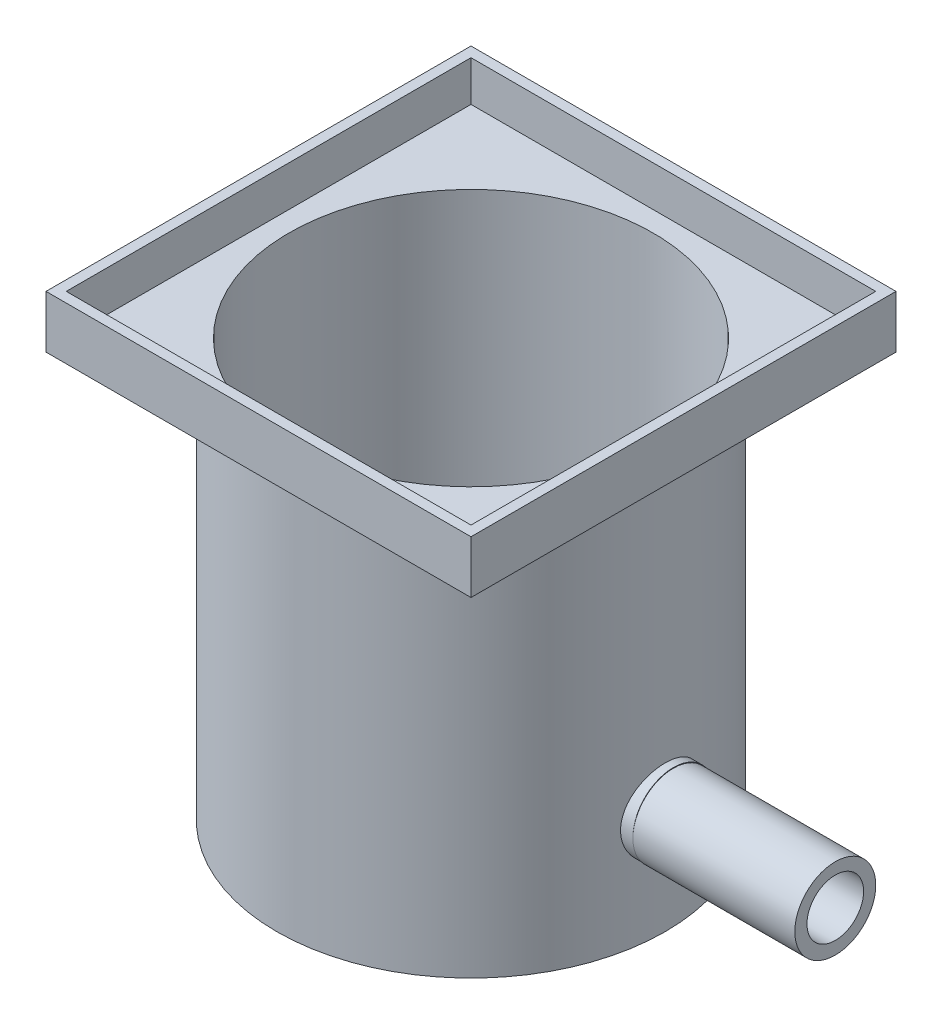
ISO-10303-21;
HEADER;
FILE_DESCRIPTION(('STEP AP214'),'2;1');
FILE_NAME('part.step','',(''),(''),'','','');
FILE_SCHEMA(('AUTOMOTIVE_DESIGN { 1 0 10303 214 1 1 1 1 }'));
ENDSEC;
DATA;
#1=APPLICATION_CONTEXT('core data for automotive mechanical design processes');
#2=APPLICATION_PROTOCOL_DEFINITION('international standard','automotive_design',2000,#1);
#3=PRODUCT_CONTEXT('',#1,'mechanical');
#4=PRODUCT('Part','Part','',(#3));
#5=PRODUCT_RELATED_PRODUCT_CATEGORY('part','',(#4));
#6=PRODUCT_DEFINITION_FORMATION('','',#4);
#7=PRODUCT_DEFINITION_CONTEXT('part definition',#1,'design');
#8=PRODUCT_DEFINITION('design','',#6,#7);
#9=PRODUCT_DEFINITION_SHAPE('','',#8);
#10=(LENGTH_UNIT() NAMED_UNIT(*) SI_UNIT(.MILLI.,.METRE.));
#11=(NAMED_UNIT(*) PLANE_ANGLE_UNIT() SI_UNIT($,.RADIAN.));
#12=(NAMED_UNIT(*) SI_UNIT($,.STERADIAN.) SOLID_ANGLE_UNIT());
#13=UNCERTAINTY_MEASURE_WITH_UNIT(LENGTH_MEASURE(1.E-05),#10,'distance_accuracy_value','');
#14=(GEOMETRIC_REPRESENTATION_CONTEXT(3) GLOBAL_UNCERTAINTY_ASSIGNED_CONTEXT((#13)) GLOBAL_UNIT_ASSIGNED_CONTEXT((#10,
#11,#12)) REPRESENTATION_CONTEXT('',''));
#15=CARTESIAN_POINT('',(0.,0.,0.));
#16=DIRECTION('',(0.,0.,1.));
#17=DIRECTION('',(1.,0.,0.));
#18=AXIS2_PLACEMENT_3D('',#15,#16,#17);
#19=CARTESIAN_POINT('',(0.,0.,0.));
#20=DIRECTION('',(0.,1.,0.));
#21=DIRECTION('',(0.,0.,1.));
#22=AXIS2_PLACEMENT_3D('',#19,#20,#21);
#23=PLANE('',#22);
#24=CARTESIAN_POINT('',(0.,0.,0.));
#25=DIRECTION('',(0.,1.,0.));
#26=DIRECTION('',(0.,0.,1.));
#27=AXIS2_PLACEMENT_3D('',#24,#25,#26);
#28=CIRCLE('',#27,48.);
#29=CARTESIAN_POINT('',(0.,0.,48.));
#30=VERTEX_POINT('',#29);
#31=EDGE_CURVE('E45',#30,#30,#28,.T.);
#32=ORIENTED_EDGE('',*,*,#31,.F.);
#33=EDGE_LOOP('',(#32));
#34=FACE_BOUND('',#33,.T.);
#35=CARTESIAN_POINT('',(0.,0.,0.));
#36=DIRECTION('',(0.,1.,0.));
#37=DIRECTION('',(0.,0.,1.));
#38=AXIS2_PLACEMENT_3D('',#35,#36,#37);
#39=CIRCLE('',#38,45.);
#40=CARTESIAN_POINT('',(0.,0.,45.));
#41=VERTEX_POINT('',#40);
#42=EDGE_CURVE('E233',#41,#41,#39,.T.);
#43=ORIENTED_EDGE('',*,*,#42,.T.);
#44=EDGE_LOOP('',(#43));
#45=FACE_BOUND('',#44,.T.);
#46=ADVANCED_FACE('F41',(#34,#45),#23,.F.);
#47=CARTESIAN_POINT('',(0.,100.,0.));
#48=DIRECTION('',(0.,-1.,0.));
#49=DIRECTION('',(0.,0.,-1.));
#50=AXIS2_PLACEMENT_3D('',#47,#48,#49);
#51=CYLINDRICAL_SURFACE('',#50,48.);
#52=CARTESIAN_POINT('',(46.946778377222,26.1260976131434,-10.));
#53=CARTESIAN_POINT('',(46.9467750144296,26.4037527578996,-10.0000059367501));
#54=CARTESIAN_POINT('',(46.9492460757447,26.6813353654834,-9.98843329820384));
#55=CARTESIAN_POINT('',(46.9590493089708,27.2345731849898,-9.94224802384046));
#56=CARTESIAN_POINT('',(46.9663822631089,27.5102280795508,-9.90763168053151));
#57=CARTESIAN_POINT('',(46.9857022730927,28.0577157472274,-9.81559856398217));
#58=CARTESIAN_POINT('',(46.9976924204909,28.3295458568952,-9.75816664465758));
#59=CARTESIAN_POINT('',(47.0259717280724,28.8672848363032,-9.62096078923888));
#60=CARTESIAN_POINT('',(47.0422609782949,29.1331935819015,-9.541186385208));
#61=CARTESIAN_POINT('',(47.0786437455751,29.6569452117754,-9.36001183052126));
#62=CARTESIAN_POINT('',(47.0987331631396,29.9147964421521,-9.25863496910163));
#63=CARTESIAN_POINT('',(47.1421509437826,30.4209770297271,-9.03496398647316));
#64=CARTESIAN_POINT('',(47.1654793344464,30.6693063058069,-8.91266968711504));
#65=CARTESIAN_POINT('',(47.2147096396184,31.1547262955506,-8.64807999132343));
#66=CARTESIAN_POINT('',(47.2406109697217,31.3918195433216,-8.5057891337785));
#67=CARTESIAN_POINT('',(47.2942787215117,31.8533447514855,-8.20213207348429));
#68=CARTESIAN_POINT('',(47.3220457558934,32.0777725075883,-8.04075959100263));
#69=CARTESIAN_POINT('',(47.3790589910125,32.5153809121166,-7.69775256721494));
#70=CARTESIAN_POINT('',(47.4083201788705,32.7283669398742,-7.51587217231564));
#71=CARTESIAN_POINT('',(47.4671474048335,33.1383186998443,-7.13491793547705));
#72=CARTESIAN_POINT('',(47.4967134451861,33.3352843138435,-6.93584396669016));
#73=CARTESIAN_POINT('',(47.5553360492789,33.7119138856573,-6.52178907284975));
#74=CARTESIAN_POINT('',(47.5843924843308,33.8915735232937,-6.30680419943981));
#75=CARTESIAN_POINT('',(47.6411730447005,34.232241983139,-5.86248787908255));
#76=CARTESIAN_POINT('',(47.6688976334804,34.3932573211937,-5.63316148765125));
#77=CARTESIAN_POINT('',(47.7225163085657,34.6970451661315,-5.15934291077062));
#78=CARTESIAN_POINT('',(47.7483900356567,34.8396256151286,-4.91472521827052));
#79=CARTESIAN_POINT('',(47.7972739545543,35.1036381862927,-4.41405244388221));
#80=CARTESIAN_POINT('',(47.8202841225768,35.2250701328078,-4.15799726702062));
#81=CARTESIAN_POINT('',(47.8627830064594,35.4458475015454,-3.63627401748139));
#82=CARTESIAN_POINT('',(47.8822719989754,35.5451946590926,-3.37060670199171));
#83=CARTESIAN_POINT('',(47.9171708108143,35.7210280907277,-2.83155077217956));
#84=CARTESIAN_POINT('',(47.9325806949656,35.7975147281355,-2.5581622806445));
#85=CARTESIAN_POINT('',(47.9586884434622,35.9260825466205,-2.00960726288658));
#86=CARTESIAN_POINT('',(47.9694503713508,35.9784962153966,-1.73452169263269));
#87=CARTESIAN_POINT('',(47.9862737939318,36.0600832203326,-1.1807827368168));
#88=CARTESIAN_POINT('',(47.9923353289117,36.0892567556857,-0.902129381855389));
#89=CARTESIAN_POINT('',(47.9995854590318,36.1241222169463,-0.343319711949417));
#90=CARTESIAN_POINT('',(48.0007744987335,36.129816285097,-0.0631635364562298));
#91=CARTESIAN_POINT('',(47.9982469522258,36.1176813780553,0.496615331128047));
#92=CARTESIAN_POINT('',(47.9945304076125,36.0998526023211,0.77623802772255));
#93=CARTESIAN_POINT('',(47.9823924917312,36.0412774774032,1.32858715312234));
#94=CARTESIAN_POINT('',(47.9740447969413,36.0008899462547,1.60135334641009));
#95=CARTESIAN_POINT('',(47.9529270087443,35.8977787500674,2.14245222963328));
#96=CARTESIAN_POINT('',(47.9401569685705,35.8350553538925,2.41078497289489));
#97=CARTESIAN_POINT('',(47.9105457513332,35.6877706837248,2.94111077864362));
#98=CARTESIAN_POINT('',(47.8937052007102,35.603212769868,3.20310480982259));
#99=CARTESIAN_POINT('',(47.8564021203907,35.4128587083493,3.71910206472143));
#100=CARTESIAN_POINT('',(47.8359382421623,35.3070546513135,3.97310227169857));
#101=CARTESIAN_POINT('',(47.7918005192199,35.0742448298523,4.47293716405828));
#102=CARTESIAN_POINT('',(47.7681065602581,34.9471049563225,4.71870759722456));
#103=CARTESIAN_POINT('',(47.7182544904233,34.6730247095232,5.1986939426669));
#104=CARTESIAN_POINT('',(47.6920962873745,34.5260835954943,5.43290942222703));
#105=CARTESIAN_POINT('',(47.6380204435049,34.2134144985893,5.88825854519341));
#106=CARTESIAN_POINT('',(47.610102649331,34.0476848772354,6.10939104511731));
#107=CARTESIAN_POINT('',(47.5532617441455,33.6985712332867,6.53711350419087));
#108=CARTESIAN_POINT('',(47.5243386205312,33.5151869893237,6.74370328093562));
#109=CARTESIAN_POINT('',(47.4657169883309,33.1283485851553,7.14475776372053));
#110=CARTESIAN_POINT('',(47.436014166781,32.9245801908001,7.33891887311532));
#111=CARTESIAN_POINT('',(47.3772107681457,32.5013625111427,7.70941583367627));
#112=CARTESIAN_POINT('',(47.3481101802813,32.28191350681,7.88575200409792));
#113=CARTESIAN_POINT('',(47.2913290827729,31.828758175767,8.21941909525054));
#114=CARTESIAN_POINT('',(47.2636489054448,31.5950485404167,8.37674558007634));
#115=CARTESIAN_POINT('',(47.2105205290509,31.1150953541243,8.67116659896557));
#116=CARTESIAN_POINT('',(47.1850714817891,30.8688566230535,8.80826883521436));
#117=CARTESIAN_POINT('',(47.1370689371822,30.364773544466,9.06164518140977));
#118=CARTESIAN_POINT('',(47.1145234253809,30.1068997177417,9.17786218369272));
#119=CARTESIAN_POINT('',(47.0730778327101,29.5819769425709,9.38812201453408));
#120=CARTESIAN_POINT('',(47.0541777657374,29.3149279591523,9.48216475856234));
#121=CARTESIAN_POINT('',(47.0205947355682,28.7736035473302,9.64731978299835));
#122=CARTESIAN_POINT('',(47.0059112801665,28.4993289664548,9.71843473988659));
#123=CARTESIAN_POINT('',(46.9812073314838,27.94553425496,9.83716637802237));
#124=CARTESIAN_POINT('',(46.9711867561373,27.6660142167493,9.88478347282669));
#125=CARTESIAN_POINT('',(46.9562571545801,27.1090259608336,9.95546049934579));
#126=CARTESIAN_POINT('',(46.9512567735114,26.8316158368455,9.97895950302546));
#127=CARTESIAN_POINT('',(46.9461943712359,26.2757585973164,10.0027488454236));
#128=CARTESIAN_POINT('',(46.9461322893087,25.9973114945681,10.0030394695085));
#129=CARTESIAN_POINT('',(46.9509481741991,25.4414222572958,9.9804106938079));
#130=CARTESIAN_POINT('',(46.9558258550843,25.1639800655364,9.95749263743034));
#131=CARTESIAN_POINT('',(46.9703747867247,24.6120958175008,9.88863627976631));
#132=CARTESIAN_POINT('',(46.9800460258433,24.3376537539433,9.84269803436251));
#133=CARTESIAN_POINT('',(47.0037679167349,23.7966183042514,9.7287791035422));
#134=CARTESIAN_POINT('',(47.0177711664993,23.5299726057342,9.66103669529469));
#135=CARTESIAN_POINT('',(47.0497846018983,23.0033898516563,9.5039039975798));
#136=CARTESIAN_POINT('',(47.0677947508719,22.74345273474,9.4145139061758));
#137=CARTESIAN_POINT('',(47.1073074569993,22.2320759828462,9.21476746811733));
#138=CARTESIAN_POINT('',(47.1288096097017,21.9806353678551,9.10441354928762));
#139=CARTESIAN_POINT('',(47.1747137437169,21.487795467269,8.8634879178588));
#140=CARTESIAN_POINT('',(47.1991168248968,21.2464000373677,8.73290853119129));
#141=CARTESIAN_POINT('',(47.2504907333666,20.7721067847243,8.45056130562366));
#142=CARTESIAN_POINT('',(47.2774920691988,20.5393699765606,8.29852852185425));
#143=CARTESIAN_POINT('',(47.3330314010212,20.0873725132714,7.9756488364672));
#144=CARTESIAN_POINT('',(47.3615700878469,19.8681180130397,7.80479343992763));
#145=CARTESIAN_POINT('',(47.4193855652716,19.4446199444424,7.44546706897798));
#146=CARTESIAN_POINT('',(47.4486624292587,19.240377876551,7.25699433800215));
#147=CARTESIAN_POINT('',(47.5071346434392,18.84836446183,6.86379184073788));
#148=CARTESIAN_POINT('',(47.5363300237763,18.6605859232667,6.65906924806289));
#149=CARTESIAN_POINT('',(47.5943512413591,18.2995679889411,6.2309848708294));
#150=CARTESIAN_POINT('',(47.623162060725,18.1266345944034,6.00736284999141));
#151=CARTESIAN_POINT('',(47.6790654963521,17.8002864432499,5.54622631861096));
#152=CARTESIAN_POINT('',(47.7061587500251,17.6468644241793,5.30871702547558));
#153=CARTESIAN_POINT('',(47.7578784685974,17.3605518242082,4.82131742686845));
#154=CARTESIAN_POINT('',(47.782504526986,17.2276646248042,4.57142509119304));
#155=CARTESIAN_POINT('',(47.828585822939,16.9834497607732,4.06103701987629));
#156=CARTESIAN_POINT('',(47.8500410950488,16.8721218612559,3.80054139979595));
#157=CARTESIAN_POINT('',(47.8890497325109,16.6724943456711,3.27239930313692));
#158=CARTESIAN_POINT('',(47.9066259607222,16.584059235501,3.00480574185768));
#159=CARTESIAN_POINT('',(47.9375414020281,16.4300379179845,2.46287955827583));
#160=CARTESIAN_POINT('',(47.9508806242284,16.3644516615353,2.188546950457));
#161=CARTESIAN_POINT('',(47.9729390236856,16.2566667778043,1.63517168283528));
#162=CARTESIAN_POINT('',(47.981658707917,16.2144655840891,1.3561295433529));
#163=CARTESIAN_POINT('',(47.9942291522258,16.1537901295518,0.795369807688972));
#164=CARTESIAN_POINT('',(47.9980799833661,16.1353155224299,0.513652250616737));
#165=CARTESIAN_POINT('',(48.0007763623851,16.1223699611277,-0.0450282955120007));
#166=CARTESIAN_POINT('',(47.9997150770311,16.1274522131168,-0.321980583314549));
#167=CARTESIAN_POINT('',(47.9928292137593,16.1605611010718,-0.874447676425828));
#168=CARTESIAN_POINT('',(47.9870046999473,16.1885874282447,-1.14996250103045));
#169=CARTESIAN_POINT('',(47.9707542490405,16.2673580900795,-1.69757986041896));
#170=CARTESIAN_POINT('',(47.9603284037522,16.3181019714766,-1.96968246317278));
#171=CARTESIAN_POINT('',(47.9351634798495,16.4419060097169,-2.5085578611328));
#172=CARTESIAN_POINT('',(47.9204243839811,16.5149662558302,-2.77533063501403));
#173=CARTESIAN_POINT('',(47.8870859420927,16.6825960699544,-3.3009318383392));
#174=CARTESIAN_POINT('',(47.8684977970058,16.7771033010263,-3.55978087166397));
#175=CARTESIAN_POINT('',(47.8279325356179,16.9870747681394,-4.06866730663403));
#176=CARTESIAN_POINT('',(47.8059541876717,17.1025466232422,-4.31870146515566));
#177=CARTESIAN_POINT('',(47.7592088567236,17.35357073124,-4.80816066716014));
#178=CARTESIAN_POINT('',(47.7344422408014,17.4891203416092,-5.04758710139529));
#179=CARTESIAN_POINT('',(47.6827805453554,17.7793649184002,-5.51430646849455));
#180=CARTESIAN_POINT('',(47.6558853818511,17.9340606403568,-5.74159892202631));
#181=CARTESIAN_POINT('',(47.6002047789151,18.264389842632,-6.18640604259484));
#182=CARTESIAN_POINT('',(47.5713946134011,18.4403404468369,-6.40368216732334));
#183=CARTESIAN_POINT('',(47.5131091645978,18.8097596355503,-6.82269833882563));
#184=CARTESIAN_POINT('',(47.4836338741366,19.00322840902,-7.02443821797293));
#185=CARTESIAN_POINT('',(47.4248262943643,19.4064305052681,-7.41108007737351));
#186=CARTESIAN_POINT('',(47.3954940419477,19.6161678104823,-7.59597791055983));
#187=CARTESIAN_POINT('',(47.3377973443307,20.0504604095576,-7.94762215928431));
#188=CARTESIAN_POINT('',(47.3094328779745,20.2750153791874,-8.114368971781));
#189=CARTESIAN_POINT('',(47.2541354352855,20.7402559145785,-8.43046562629306));
#190=CARTESIAN_POINT('',(47.2272239551977,20.9811038964181,-8.57958032516232));
#191=CARTESIAN_POINT('',(47.1760032113561,21.4746991642938,-8.85689582528092));
#192=CARTESIAN_POINT('',(47.151692993208,21.7274420367905,-8.98510430605979));
#193=CARTESIAN_POINT('',(47.10639597706,22.2430060067852,-9.2196385828921));
#194=CARTESIAN_POINT('',(47.085407235673,22.5058210983934,-9.32597718594636));
#195=CARTESIAN_POINT('',(47.0473686521437,23.0396986242079,-9.51601059861237));
#196=CARTESIAN_POINT('',(47.0303180719377,23.3107595022504,-9.5997096516798));
#197=CARTESIAN_POINT('',(46.9931419183735,23.9987534669051,-9.78044878044674));
#198=CARTESIAN_POINT('',(46.9758550282104,24.4198327738936,-9.86266316887665));
#199=CARTESIAN_POINT('',(46.9526760805371,25.2693649852337,-9.97243309973589));
#200=CARTESIAN_POINT('',(46.9467835642925,25.6978175920375,-9.99999084262794));
#201=CARTESIAN_POINT('',(46.946778377222,26.1260976131434,-10.));
#202=B_SPLINE_CURVE_WITH_KNOTS('',3,(#52,#53,#54,#55,#56,#57,#58,#59,#60,#61,#62,#63,#64,#65,
#66,#67,#68,#69,#70,#71,#72,#73,#74,#75,#76,#77,#78,#79,#80,#81,#82,#83,#84,#85,#86,#87,#88,#89,
#90,#91,#92,#93,#94,#95,#96,#97,#98,#99,#100,#101,#102,#103,#104,#105,#106,#107,#108,#109,#110,
#111,#112,#113,#114,#115,#116,#117,#118,#119,#120,#121,#122,#123,#124,#125,#126,#127,#128,#129,
#130,#131,#132,#133,#134,#135,#136,#137,#138,#139,#140,#141,#142,#143,#144,#145,#146,#147,#148,
#149,#150,#151,#152,#153,#154,#155,#156,#157,#158,#159,#160,#161,#162,#163,#164,#165,#166,#167,
#168,#169,#170,#171,#172,#173,#174,#175,#176,#177,#178,#179,#180,#181,#182,#183,#184,#185,#186,
#187,#188,#189,#190,#191,#192,#193,#194,#195,#196,#197,#198,#199,#200,#201),.UNSPECIFIED.,.T.,
.F.,(4,2,2,2,2,2,2,2,2,2,2,2,2,2,2,2,2,2,2,2,2,2,2,2,2,2,2,2,2,2,2,2,2,2,2,2,2,2,2,2,2,2,2,2,2,
2,2,2,2,2,2,2,2,2,2,2,2,2,2,2,2,2,2,2,2,2,2,2,2,2,2,2,2,2,4),(0.,0.832588686514774,
1.66531136025463,2.49858776187357,3.33188161678043,4.16428161638459,4.9966887057119,
5.82890715663321,6.66140025559996,7.50522244921943,8.34905086876761,9.19308939449833,
10.0368320479859,10.8887571290749,11.7406892856058,12.5925544774058,13.4444061298829,
14.2841096393369,15.1238059515438,15.9634256490021,16.8030382270866,17.6296614127663,
18.4562746484549,19.282760751527,20.1095551057049,20.9417556664485,21.7739873682531,
22.6062917018815,23.4386064729881,24.2866785760232,25.1347354868793,25.9829899109727,
26.830920447898,27.6811353746918,28.5313535425247,29.381472423978,30.2315763430073,
31.0659137530613,31.9002409042382,32.7345197641042,33.5687965987261,34.3942494672548,
35.2196947836684,36.0450445633195,36.8707082727534,37.7076447455906,38.5449604996538,
39.3823598289157,40.2193915168082,41.0708351177902,41.9219608640787,42.7732266173836,
43.6244830955625,44.4705797396226,45.3166745653845,46.16267651664,47.0086661199953,
47.8386765348455,48.6686757791778,49.4986584639542,50.328644468879,51.1562482854619,
51.9841534779521,52.8119498026905,53.6397788039603,54.4819930110354,55.3242163038084,
56.1666464222641,57.0090581132689,57.8616718839354,58.7139717530266,59.5657710851543,
60.4174106490271,61.7017212901298,62.9859802241612),.UNSPECIFIED.);
#203=CARTESIAN_POINT('',(46.946778377222,26.1260976131434,-10.));
#204=VERTEX_POINT('',#203);
#205=EDGE_CURVE('E226',#204,#204,#202,.T.);
#206=ORIENTED_EDGE('',*,*,#205,.F.);
#207=EDGE_LOOP('',(#206));
#208=FACE_BOUND('',#207,.T.);
#209=CARTESIAN_POINT('',(0.,100.,0.));
#210=DIRECTION('',(0.,1.,0.));
#211=DIRECTION('',(0.,0.,1.));
#212=AXIS2_PLACEMENT_3D('',#209,#210,#211);
#213=CIRCLE('',#212,48.);
#214=CARTESIAN_POINT('',(0.,100.,48.));
#215=VERTEX_POINT('',#214);
#216=EDGE_CURVE('E11',#215,#215,#213,.T.);
#217=ORIENTED_EDGE('',*,*,#216,.F.);
#218=EDGE_LOOP('',(#217));
#219=FACE_BOUND('',#218,.T.);
#220=ORIENTED_EDGE('',*,*,#31,.T.);
#221=EDGE_LOOP('',(#220));
#222=FACE_BOUND('',#221,.T.);
#223=ADVANCED_FACE('F43',(#208,#219,#222),#51,.T.);
#224=CARTESIAN_POINT('',(0.,100.,0.));
#225=DIRECTION('',(0.,-1.,0.));
#226=DIRECTION('',(0.,0.,-1.));
#227=AXIS2_PLACEMENT_3D('',#224,#225,#226);
#228=CYLINDRICAL_SURFACE('',#227,45.);
#229=CARTESIAN_POINT('',(44.4522215417857,26.1260976131434,-7.));
#230=CARTESIAN_POINT('',(44.452220355855,25.9307139035128,-7.0000027769611));
#231=CARTESIAN_POINT('',(44.4535122503936,25.7353686320713,-6.99181702459507));
#232=CARTESIAN_POINT('',(44.4586398393364,25.3460195173857,-6.95914031830319));
#233=CARTESIAN_POINT('',(44.4624760592444,25.1520159596244,-6.9346459960081));
#234=CARTESIAN_POINT('',(44.4725858513711,24.7666760890894,-6.86951145550587));
#235=CARTESIAN_POINT('',(44.4788610464926,24.5753416403495,-6.82886048620007));
#236=CARTESIAN_POINT('',(44.4936688968287,24.196755237488,-6.73170423245663));
#237=CARTESIAN_POINT('',(44.5022023803437,24.0095048086458,-6.67519313033943));
#238=CARTESIAN_POINT('',(44.5212684758716,23.6406948373816,-6.54682020834857));
#239=CARTESIAN_POINT('',(44.5317987411946,23.4591289032839,-6.47497639571401));
#240=CARTESIAN_POINT('',(44.5545683213471,23.1026536485738,-6.3163958371616));
#241=CARTESIAN_POINT('',(44.5668082656654,22.9277468101051,-6.22965360306186));
#242=CARTESIAN_POINT('',(44.5926408018923,22.5859502146937,-6.04196576839994));
#243=CARTESIAN_POINT('',(44.6062327010323,22.419056416055,-5.94102743134076));
#244=CARTESIAN_POINT('',(44.6343978895039,22.0942662695263,-5.72558526491072));
#245=CARTESIAN_POINT('',(44.648971542425,21.9363732954758,-5.61107639768418));
#246=CARTESIAN_POINT('',(44.6787981487478,21.6296006974154,-5.36843009028553));
#247=CARTESIAN_POINT('',(44.6940552980044,21.4807956151548,-5.24019891515443));
#248=CARTESIAN_POINT('',(44.7247244664909,21.1944389984919,-4.97164839223494));
#249=CARTESIAN_POINT('',(44.7401365409539,21.0568916498488,-4.83132458771533));
#250=CARTESIAN_POINT('',(44.7706727591219,20.794102614319,-4.53964220069432));
#251=CARTESIAN_POINT('',(44.7857969907696,20.6688571186381,-4.38828705906424));
#252=CARTESIAN_POINT('',(44.8153444295057,20.431452893913,-4.07548610571743));
#253=CARTESIAN_POINT('',(44.8297673760578,20.3192990072164,-3.91403659397093));
#254=CARTESIAN_POINT('',(44.8575715246657,20.1083979457526,-3.58137810731919));
#255=CARTESIAN_POINT('',(44.8709471502544,20.0097206962352,-3.41012432209674));
#256=CARTESIAN_POINT('',(44.8961966872442,19.8271568643541,-3.05979741311949));
#257=CARTESIAN_POINT('',(44.9080705849333,19.7432704170397,-2.88072421798722));
#258=CARTESIAN_POINT('',(44.9299779691039,19.590915366469,-2.51603703638233));
#259=CARTESIAN_POINT('',(44.9400115622129,19.5224458699005,-2.33042342960529));
#260=CARTESIAN_POINT('',(44.9579526620773,19.4014346965461,-1.95397014805497));
#261=CARTESIAN_POINT('',(44.9658601378163,19.3488932521226,-1.76313039708571));
#262=CARTESIAN_POINT('',(44.9792663330232,19.2605098867589,-1.37919784011995));
#263=CARTESIAN_POINT('',(44.9847843776941,19.224533832241,-1.18613658991586));
#264=CARTESIAN_POINT('',(44.9933516542339,19.1689109533103,-0.797555984637061));
#265=CARTESIAN_POINT('',(44.9964000327393,19.1492697731551,-0.602035803586753));
#266=CARTESIAN_POINT('',(44.9999358200213,19.126500055028,-0.21008063835347));
#267=CARTESIAN_POINT('',(45.0004242880897,19.1233646869432,-0.0136460662305837));
#268=CARTESIAN_POINT('',(44.9988349369064,19.1335934564556,0.378802257555777));
#269=CARTESIAN_POINT('',(44.9967561731042,19.1469636668784,0.574815827735396));
#270=CARTESIAN_POINT('',(44.9867880653354,19.2113808833064,1.15656367991761));
#271=CARTESIAN_POINT('',(44.9751997984349,19.2865170003054,1.53986077571304));
#272=CARTESIAN_POINT('',(44.9433551242895,19.4991820461384,2.28812572528073));
#273=CARTESIAN_POINT('',(44.9230984804337,19.6367126780906,2.65309307842301));
#274=CARTESIAN_POINT('',(44.8760498387293,19.9708378898114,3.35631314805154));
#275=CARTESIAN_POINT('',(44.8492317651852,20.1676688749175,3.69445196432431));
#276=CARTESIAN_POINT('',(44.7920445831534,20.6146342294767,4.33309901467645));
#277=CARTESIAN_POINT('',(44.7616752236504,20.8647723678625,4.63360458561656));
#278=CARTESIAN_POINT('',(44.7003906931618,21.41439710518,5.19181010229621));
#279=CARTESIAN_POINT('',(44.669473146345,21.7143775457584,5.44902382327986));
#280=CARTESIAN_POINT('',(44.6108891172901,22.3534981725251,5.90953744965338));
#281=CARTESIAN_POINT('',(44.5832226580461,22.6926386356505,6.112836973732));
#282=CARTESIAN_POINT('',(44.5342733555279,23.4009775723286,6.45982800098622));
#283=CARTESIAN_POINT('',(44.512996164415,23.7702022945476,6.60346676903532));
#284=CARTESIAN_POINT('',(44.4793322886092,24.5279414393721,6.826554705252));
#285=CARTESIAN_POINT('',(44.4669449274948,24.9164543919432,6.90600875725073));
#286=CARTESIAN_POINT('',(44.45259240615,25.6974072717639,6.9977993517633));
#287=CARTESIAN_POINT('',(44.4505200190388,26.0897641291014,7.01082645492191));
#288=CARTESIAN_POINT('',(44.4567471150251,26.8710559960748,6.97122814207023));
#289=CARTESIAN_POINT('',(44.4650462510936,27.2599911197628,6.9186049227054));
#290=CARTESIAN_POINT('',(44.4909825981098,28.0212421726144,6.74978681421934));
#291=CARTESIAN_POINT('',(44.508568903592,28.3936368171461,6.63393836483982));
#292=CARTESIAN_POINT('',(44.5510558653949,29.1137238505145,6.3423182673934));
#293=CARTESIAN_POINT('',(44.5759569078281,29.4614149341572,6.16654345600275));
#294=CARTESIAN_POINT('',(44.6305190372917,30.1253123296062,5.75841565632198));
#295=CARTESIAN_POINT('',(44.6602169489946,30.441241636814,5.52561712510973));
#296=CARTESIAN_POINT('',(44.7209170837089,31.0297995537269,5.01064782434323));
#297=CARTESIAN_POINT('',(44.7519193861434,31.3024255219014,4.72847404507315));
#298=CARTESIAN_POINT('',(44.8120702864429,31.799113166402,4.11978907873501));
#299=CARTESIAN_POINT('',(44.8411997100473,32.0227161307698,3.79290204103117));
#300=CARTESIAN_POINT('',(44.8940266769088,32.4118784755901,3.10558658758067));
#301=CARTESIAN_POINT('',(44.917724377761,32.5774395401335,2.74515914539589));
#302=CARTESIAN_POINT('',(44.9471481361908,32.7781910018555,2.18828703968117));
#303=CARTESIAN_POINT('',(44.9559273781453,32.8371259576398,2.00023865927207));
#304=CARTESIAN_POINT('',(44.9712403823032,32.9389555957157,1.61977496802397));
#305=CARTESIAN_POINT('',(44.9777749487786,32.9818560236983,1.42736124769359));
#306=CARTESIAN_POINT('',(44.9884102520409,33.0512854537006,1.03952351454837));
#307=CARTESIAN_POINT('',(44.9925106713276,33.0778123200381,0.84409911244177));
#308=CARTESIAN_POINT('',(44.9981609106772,33.1142886369195,0.451674100936447));
#309=CARTESIAN_POINT('',(44.9997108096564,33.124238600375,0.254673540495681));
#310=CARTESIAN_POINT('',(45.0002127911111,33.1274654809154,-0.137387258682405));
#311=CARTESIAN_POINT('',(44.9991920896384,33.1209170730605,-0.332446057051275));
#312=CARTESIAN_POINT('',(44.994638866769,33.0915650489308,-0.721304287984005));
#313=CARTESIAN_POINT('',(44.9911063882665,33.0687617102451,-0.915103741996939));
#314=CARTESIAN_POINT('',(44.9816276678225,33.0070681148266,-1.30009974318262));
#315=CARTESIAN_POINT('',(44.9756809939318,32.9681749792748,-1.49129581822697));
#316=CARTESIAN_POINT('',(44.9615425923498,32.8746120814621,-1.86962869656679));
#317=CARTESIAN_POINT('',(44.9533516758807,32.8199480195112,-2.05676694031252));
#318=CARTESIAN_POINT('',(44.9349562995308,32.695275167486,-2.42565308935544));
#319=CARTESIAN_POINT('',(44.92475284233,32.6252740166769,-2.60740362723429));
#320=CARTESIAN_POINT('',(44.9026162369975,32.4704501528761,-2.96428949855945));
#321=CARTESIAN_POINT('',(44.8906837114839,32.385632772793,-3.13942718472444));
#322=CARTESIAN_POINT('',(44.8654101272797,32.2017309215221,-3.48202423253828));
#323=CARTESIAN_POINT('',(44.8520685290353,32.1026409798475,-3.64948061744795));
#324=CARTESIAN_POINT('',(44.8243522726043,31.8909531322677,-3.97544903521474));
#325=CARTESIAN_POINT('',(44.8099779810048,31.7783600103365,-4.13396420671652));
#326=CARTESIAN_POINT('',(44.7804331055922,31.5391757020132,-4.44264607956079));
#327=CARTESIAN_POINT('',(44.7652557905199,31.4124510073141,-4.59270870537755));
#328=CARTESIAN_POINT('',(44.7346748502419,31.1469060351679,-4.88159418714703));
#329=CARTESIAN_POINT('',(44.7192713081736,31.0080901130887,-5.0204210558418));
#330=CARTESIAN_POINT('',(44.6886550086194,30.7191928839384,-5.28601924865263));
#331=CARTESIAN_POINT('',(44.6734423712714,30.5691048611513,-5.41278328235162));
#332=CARTESIAN_POINT('',(44.6436514302209,30.2588262022976,-5.65323473932963));
#333=CARTESIAN_POINT('',(44.629072894526,30.0986393144449,-5.76692697050754));
#334=CARTESIAN_POINT('',(44.6008660171103,29.7681471160476,-5.98117936133565));
#335=CARTESIAN_POINT('',(44.5872444303494,29.5977830665365,-6.08164983653716));
#336=CARTESIAN_POINT('',(44.5614544034106,29.2491451910469,-6.26782368461854));
#337=CARTESIAN_POINT('',(44.5492854294569,29.0708743037403,-6.35353248696837));
#338=CARTESIAN_POINT('',(44.5267573576771,28.7077482182683,-6.50953873943758));
#339=CARTESIAN_POINT('',(44.5163969548025,28.5228978847008,-6.57984731163516));
#340=CARTESIAN_POINT('',(44.4977808344736,28.1478771458927,-6.7045854014159));
#341=CARTESIAN_POINT('',(44.4895246514713,27.957707927779,-6.75901843176809));
#342=CARTESIAN_POINT('',(44.4725674512201,27.4975304382298,-6.86986842106569));
#343=CARTESIAN_POINT('',(44.4649735720957,27.225595307331,-6.91861204687555));
#344=CARTESIAN_POINT('',(44.4548014908296,26.6777804197046,-6.9836756409137));
#345=CARTESIAN_POINT('',(44.4522232158423,26.4019007203257,-6.99999608004935));
#346=CARTESIAN_POINT('',(44.4522215417857,26.1260976131434,-7.));
#347=B_SPLINE_CURVE_WITH_KNOTS('',3,(#229,#230,#231,#232,#233,#234,#235,#236,#237,#238,#239,
#240,#241,#242,#243,#244,#245,#246,#247,#248,#249,#250,#251,#252,#253,#254,#255,#256,#257,#258,
#259,#260,#261,#262,#263,#264,#265,#266,#267,#268,#269,#270,#271,#272,#273,#274,#275,#276,#277,
#278,#279,#280,#281,#282,#283,#284,#285,#286,#287,#288,#289,#290,#291,#292,#293,#294,#295,#296,
#297,#298,#299,#300,#301,#302,#303,#304,#305,#306,#307,#308,#309,#310,#311,#312,#313,#314,#315,
#316,#317,#318,#319,#320,#321,#322,#323,#324,#325,#326,#327,#328,#329,#330,#331,#332,#333,#334,
#335,#336,#337,#338,#339,#340,#341,#342,#343,#344,#345,#346),.UNSPECIFIED.,.T.,.F.,(4,2,2,2,2,2,
2,2,2,2,2,2,2,2,2,2,2,2,2,2,2,2,2,2,2,2,2,2,2,2,2,2,2,2,2,2,2,2,2,2,2,2,2,2,2,2,2,2,2,2,2,2,2,2,
2,2,2,2,4),(0.,0.585909402834802,1.17193985685214,1.75836092707897,2.3449973850884,
2.93094863250641,3.51711619353432,4.10298492294239,4.68907183267291,5.27945426678337,
5.87005522421792,6.46047274461064,7.05110796228994,7.64469992708345,8.2382973114612,
8.83186029186308,9.42543193088984,10.0141089053677,10.6029892034565,11.1916258034351,
11.7804790424741,12.9467475554207,14.1130479047021,15.2840607455242,16.4551564070049,
17.6386352031513,18.8221223692963,20.0066534244179,21.1910943397824,22.363196582816,
23.5352596086164,24.7009639239097,25.8667297825889,27.0419121432507,28.2171661632563,
29.4029875922549,30.5887746116906,31.1799774960171,31.7709683296206,32.3620362327127,
32.9530858470362,33.5379041287098,34.1227124235492,34.7076253987562,35.2923272248524,
35.8767384756793,36.4609398071071,37.0453656541052,37.6295850560875,38.2198856786736,
38.8099745421576,39.4004178023581,39.9906431939998,40.5846857549545,41.1785093531731,
41.7719026662935,42.3651645799419,43.1922446940722,44.019312795782),.UNSPECIFIED.);
#348=CARTESIAN_POINT('',(44.4522215417857,26.1260976131434,-7.));
#349=VERTEX_POINT('',#348);
#350=EDGE_CURVE('E186',#349,#349,#347,.T.);
#351=ORIENTED_EDGE('',*,*,#350,.F.);
#352=EDGE_LOOP('',(#351));
#353=FACE_BOUND('',#352,.T.);
#354=ORIENTED_EDGE('',*,*,#42,.F.);
#355=EDGE_LOOP('',(#354));
#356=FACE_BOUND('',#355,.T.);
#357=CARTESIAN_POINT('',(0.,103.,0.));
#358=DIRECTION('',(0.,1.,0.));
#359=DIRECTION('',(0.,0.,1.));
#360=AXIS2_PLACEMENT_3D('',#357,#358,#359);
#361=CIRCLE('',#360,45.);
#362=CARTESIAN_POINT('',(0.,103.,45.));
#363=VERTEX_POINT('',#362);
#364=EDGE_CURVE('E159',#363,#363,#361,.T.);
#365=ORIENTED_EDGE('',*,*,#364,.T.);
#366=EDGE_LOOP('',(#365));
#367=FACE_BOUND('',#366,.T.);
#368=ADVANCED_FACE('F197',(#353,#356,#367),#228,.F.);
#369=CARTESIAN_POINT('',(50.,26.1260976131434,0.));
#370=DIRECTION('',(1.,0.,0.));
#371=DIRECTION('',(0.,0.,-1.));
#372=AXIS2_PLACEMENT_3D('',#369,#370,#371);
#373=PLANE('',#372);
#374=CARTESIAN_POINT('',(50.,25.9749969651252,0.));
#375=DIRECTION('',(1.,0.,0.));
#376=DIRECTION('',(0.,0.,-1.));
#377=AXIS2_PLACEMENT_3D('',#374,#375,#376);
#378=CIRCLE('',#377,10.);
#379=CARTESIAN_POINT('',(50.,26.0505472891343,-9.99971460335454));
#380=VERTEX_POINT('',#379);
#381=CARTESIAN_POINT('',(50.,26.0505472891343,9.99971460335454));
#382=VERTEX_POINT('',#381);
#383=EDGE_CURVE('E502',#380,#382,#378,.T.);
#384=ORIENTED_EDGE('',*,*,#383,.F.);
#385=CARTESIAN_POINT('',(50.,26.1260976131434,0.));
#386=DIRECTION('',(1.,0.,0.));
#387=DIRECTION('',(0.,0.,-1.));
#388=AXIS2_PLACEMENT_3D('',#385,#386,#387);
#389=CIRCLE('',#388,10.);
#390=EDGE_CURVE('E501',#380,#382,#389,.T.);
#391=ORIENTED_EDGE('',*,*,#390,.T.);
#392=EDGE_LOOP('',(#384,#391));
#393=FACE_BOUND('',#392,.T.);
#394=ADVANCED_FACE('F224',(#393),#373,.T.);
#395=CARTESIAN_POINT('',(-48.001,26.1260976131434,0.));
#396=DIRECTION('',(1.,0.,0.));
#397=DIRECTION('',(0.,0.,-1.));
#398=AXIS2_PLACEMENT_3D('',#395,#396,#397);
#399=CYLINDRICAL_SURFACE('',#398,10.);
#400=EDGE_CURVE('E234',#382,#380,#389,.T.);
#401=ORIENTED_EDGE('',*,*,#400,.F.);
#402=ORIENTED_EDGE('',*,*,#390,.F.);
#403=EDGE_LOOP('',(#401,#402));
#404=FACE_BOUND('',#403,.T.);
#405=ORIENTED_EDGE('',*,*,#205,.T.);
#406=EDGE_LOOP('',(#405));
#407=FACE_BOUND('',#406,.T.);
#408=ADVANCED_FACE('F217',(#404,#407),#399,.T.);
#409=CARTESIAN_POINT('',(50.,25.9749969651252,0.));
#410=DIRECTION('',(1.,0.,0.));
#411=DIRECTION('',(0.,0.,-1.));
#412=AXIS2_PLACEMENT_3D('',#409,#410,#411);
#413=PLANE('',#412);
#414=EDGE_CURVE('E194',#382,#380,#378,.T.);
#415=ORIENTED_EDGE('',*,*,#414,.F.);
#416=ORIENTED_EDGE('',*,*,#400,.T.);
#417=EDGE_LOOP('',(#415,#416));
#418=FACE_BOUND('',#417,.T.);
#419=ADVANCED_FACE('F214',(#418),#413,.F.);
#420=CARTESIAN_POINT('',(90.,25.9749969651252,0.));
#421=DIRECTION('',(-1.,0.,0.));
#422=DIRECTION('',(0.,0.,1.));
#423=AXIS2_PLACEMENT_3D('',#420,#421,#422);
#424=CYLINDRICAL_SURFACE('',#423,10.);
#425=CARTESIAN_POINT('',(90.,25.9749969651252,0.));
#426=DIRECTION('',(1.,0.,0.));
#427=DIRECTION('',(0.,0.,-1.));
#428=AXIS2_PLACEMENT_3D('',#425,#426,#427);
#429=CIRCLE('',#428,10.);
#430=CARTESIAN_POINT('',(90.,25.9749969651252,-10.));
#431=VERTEX_POINT('',#430);
#432=EDGE_CURVE('E195',#431,#431,#429,.T.);
#433=ORIENTED_EDGE('',*,*,#432,.F.);
#434=EDGE_LOOP('',(#433));
#435=FACE_BOUND('',#434,.T.);
#436=ORIENTED_EDGE('',*,*,#383,.T.);
#437=ORIENTED_EDGE('',*,*,#414,.T.);
#438=EDGE_LOOP('',(#436,#437));
#439=FACE_BOUND('',#438,.T.);
#440=ADVANCED_FACE('F212',(#435,#439),#424,.T.);
#441=CARTESIAN_POINT('',(90.,25.9749969651252,0.));
#442=DIRECTION('',(1.,0.,0.));
#443=DIRECTION('',(0.,0.,-1.));
#444=AXIS2_PLACEMENT_3D('',#441,#442,#443);
#445=PLANE('',#444);
#446=CARTESIAN_POINT('',(90.,26.1260976131434,0.));
#447=DIRECTION('',(1.,0.,0.));
#448=DIRECTION('',(0.,0.,-1.));
#449=AXIS2_PLACEMENT_3D('',#446,#447,#448);
#450=CIRCLE('',#449,7.);
#451=CARTESIAN_POINT('',(90.,26.1260976131434,-7.));
#452=VERTEX_POINT('',#451);
#453=EDGE_CURVE('E183',#452,#452,#450,.T.);
#454=ORIENTED_EDGE('',*,*,#453,.F.);
#455=EDGE_LOOP('',(#454));
#456=FACE_BOUND('',#455,.T.);
#457=ORIENTED_EDGE('',*,*,#432,.T.);
#458=EDGE_LOOP('',(#457));
#459=FACE_BOUND('',#458,.T.);
#460=ADVANCED_FACE('F206',(#456,#459),#445,.T.);
#461=CARTESIAN_POINT('',(35.,26.1260976131434,0.));
#462=DIRECTION('',(1.,0.,0.));
#463=DIRECTION('',(0.,0.,-1.));
#464=AXIS2_PLACEMENT_3D('',#461,#462,#463);
#465=CYLINDRICAL_SURFACE('',#464,7.);
#466=ORIENTED_EDGE('',*,*,#350,.T.);
#467=EDGE_LOOP('',(#466));
#468=FACE_BOUND('',#467,.T.);
#469=ORIENTED_EDGE('',*,*,#453,.T.);
#470=EDGE_LOOP('',(#469));
#471=FACE_BOUND('',#470,.T.);
#472=ADVANCED_FACE('F200',(#468,#471),#465,.F.);
#473=CARTESIAN_POINT('',(0.,103.,0.));
#474=DIRECTION('',(0.,1.,0.));
#475=DIRECTION('',(0.,0.,1.));
#476=AXIS2_PLACEMENT_3D('',#473,#474,#475);
#477=PLANE('',#476);
#478=DIRECTION('',(0.,0.,-1.));
#479=VECTOR('',#478,1.);
#480=CARTESIAN_POINT('',(50.,103.,-50.));
#481=LINE('',#480,#479);
#482=CARTESIAN_POINT('',(50.,103.,50.));
#483=VERTEX_POINT('',#482);
#484=CARTESIAN_POINT('',(50.,103.,-50.));
#485=VERTEX_POINT('',#484);
#486=EDGE_CURVE('E56',#483,#485,#481,.T.);
#487=ORIENTED_EDGE('',*,*,#486,.T.);
#488=DIRECTION('',(-1.,0.,0.));
#489=VECTOR('',#488,1.);
#490=CARTESIAN_POINT('',(-50.,103.,-50.));
#491=LINE('',#490,#489);
#492=CARTESIAN_POINT('',(-50.,103.,-50.));
#493=VERTEX_POINT('',#492);
#494=EDGE_CURVE('E60',#485,#493,#491,.T.);
#495=ORIENTED_EDGE('',*,*,#494,.T.);
#496=DIRECTION('',(0.,0.,1.));
#497=VECTOR('',#496,1.);
#498=CARTESIAN_POINT('',(-50.,103.,-50.));
#499=LINE('',#498,#497);
#500=CARTESIAN_POINT('',(-50.,103.,50.));
#501=VERTEX_POINT('',#500);
#502=EDGE_CURVE('E140',#493,#501,#499,.T.);
#503=ORIENTED_EDGE('',*,*,#502,.T.);
#504=DIRECTION('',(1.,0.,0.));
#505=VECTOR('',#504,1.);
#506=CARTESIAN_POINT('',(-50.,103.,50.));
#507=LINE('',#506,#505);
#508=EDGE_CURVE('E121',#501,#483,#507,.T.);
#509=ORIENTED_EDGE('',*,*,#508,.T.);
#510=EDGE_LOOP('',(#487,#495,#503,#509));
#511=FACE_BOUND('',#510,.T.);
#512=ORIENTED_EDGE('',*,*,#364,.F.);
#513=EDGE_LOOP('',(#512));
#514=FACE_BOUND('',#513,.T.);
#515=ADVANCED_FACE('F205',(#511,#514),#477,.T.);
#516=CARTESIAN_POINT('',(0.,100.,0.));
#517=DIRECTION('',(0.,1.,0.));
#518=DIRECTION('',(0.,0.,1.));
#519=AXIS2_PLACEMENT_3D('',#516,#517,#518);
#520=PLANE('',#519);
#521=ORIENTED_EDGE('',*,*,#216,.T.);
#522=EDGE_LOOP('',(#521));
#523=FACE_BOUND('',#522,.T.);
#524=DIRECTION('',(0.,0.,-1.));
#525=VECTOR('',#524,1.);
#526=CARTESIAN_POINT('',(52.5,100.,-52.5));
#527=LINE('',#526,#525);
#528=CARTESIAN_POINT('',(52.5,100.,52.5));
#529=VERTEX_POINT('',#528);
#530=CARTESIAN_POINT('',(52.5,100.,-52.5));
#531=VERTEX_POINT('',#530);
#532=EDGE_CURVE('E162',#529,#531,#527,.T.);
#533=ORIENTED_EDGE('',*,*,#532,.F.);
#534=DIRECTION('',(1.,0.,0.));
#535=VECTOR('',#534,1.);
#536=CARTESIAN_POINT('',(-52.5,100.,52.5));
#537=LINE('',#536,#535);
#538=CARTESIAN_POINT('',(-52.5,100.,52.5));
#539=VERTEX_POINT('',#538);
#540=EDGE_CURVE('E169',#539,#529,#537,.T.);
#541=ORIENTED_EDGE('',*,*,#540,.F.);
#542=DIRECTION('',(0.,0.,1.));
#543=VECTOR('',#542,1.);
#544=CARTESIAN_POINT('',(-52.5,100.,-52.5));
#545=LINE('',#544,#543);
#546=CARTESIAN_POINT('',(-52.5,100.,-52.5));
#547=VERTEX_POINT('',#546);
#548=EDGE_CURVE('E167',#547,#539,#545,.T.);
#549=ORIENTED_EDGE('',*,*,#548,.F.);
#550=DIRECTION('',(-1.,0.,0.));
#551=VECTOR('',#550,1.);
#552=CARTESIAN_POINT('',(-52.5,100.,-52.5));
#553=LINE('',#552,#551);
#554=EDGE_CURVE('E165',#531,#547,#553,.T.);
#555=ORIENTED_EDGE('',*,*,#554,.F.);
#556=EDGE_LOOP('',(#533,#541,#549,#555));
#557=FACE_BOUND('',#556,.T.);
#558=ADVANCED_FACE('F262',(#523,#557),#520,.F.);
#559=CARTESIAN_POINT('',(52.5,103.,-52.5));
#560=DIRECTION('',(-1.,0.,0.));
#561=DIRECTION('',(0.,0.,1.));
#562=AXIS2_PLACEMENT_3D('',#559,#560,#561);
#563=PLANE('',#562);
#564=ORIENTED_EDGE('',*,*,#532,.T.);
#565=DIRECTION('',(0.,-1.,0.));
#566=VECTOR('',#565,1.);
#567=CARTESIAN_POINT('',(52.5,103.,-52.5));
#568=LINE('',#567,#566);
#569=CARTESIAN_POINT('',(52.5,113.,-52.5));
#570=VERTEX_POINT('',#569);
#571=EDGE_CURVE('E180',#570,#531,#568,.T.);
#572=ORIENTED_EDGE('',*,*,#571,.F.);
#573=DIRECTION('',(0.,0.,-1.));
#574=VECTOR('',#573,1.);
#575=CARTESIAN_POINT('',(52.5,113.,-52.5));
#576=LINE('',#575,#574);
#577=CARTESIAN_POINT('',(52.5,113.,52.5));
#578=VERTEX_POINT('',#577);
#579=EDGE_CURVE('E126',#578,#570,#576,.T.);
#580=ORIENTED_EDGE('',*,*,#579,.F.);
#581=DIRECTION('',(0.,-1.,0.));
#582=VECTOR('',#581,1.);
#583=CARTESIAN_POINT('',(52.5,103.,52.5));
#584=LINE('',#583,#582);
#585=EDGE_CURVE('E171',#578,#529,#584,.T.);
#586=ORIENTED_EDGE('',*,*,#585,.T.);
#587=EDGE_LOOP('',(#564,#572,#580,#586));
#588=FACE_BOUND('',#587,.T.);
#589=ADVANCED_FACE('F208',(#588),#563,.F.);
#590=CARTESIAN_POINT('',(-52.5,103.,-52.5));
#591=DIRECTION('',(0.,0.,1.));
#592=DIRECTION('',(1.,0.,0.));
#593=AXIS2_PLACEMENT_3D('',#590,#591,#592);
#594=PLANE('',#593);
#595=ORIENTED_EDGE('',*,*,#554,.T.);
#596=DIRECTION('',(0.,-1.,0.));
#597=VECTOR('',#596,1.);
#598=CARTESIAN_POINT('',(-52.5,103.,-52.5));
#599=LINE('',#598,#597);
#600=CARTESIAN_POINT('',(-52.5,113.,-52.5));
#601=VERTEX_POINT('',#600);
#602=EDGE_CURVE('E177',#601,#547,#599,.T.);
#603=ORIENTED_EDGE('',*,*,#602,.F.);
#604=DIRECTION('',(-1.,0.,0.));
#605=VECTOR('',#604,1.);
#606=CARTESIAN_POINT('',(-52.5,113.,-52.5));
#607=LINE('',#606,#605);
#608=EDGE_CURVE('E150',#570,#601,#607,.T.);
#609=ORIENTED_EDGE('',*,*,#608,.F.);
#610=ORIENTED_EDGE('',*,*,#571,.T.);
#611=EDGE_LOOP('',(#595,#603,#609,#610));
#612=FACE_BOUND('',#611,.T.);
#613=ADVANCED_FACE('F278',(#612),#594,.F.);
#614=CARTESIAN_POINT('',(-52.5,103.,-52.5));
#615=DIRECTION('',(1.,0.,0.));
#616=DIRECTION('',(0.,0.,-1.));
#617=AXIS2_PLACEMENT_3D('',#614,#615,#616);
#618=PLANE('',#617);
#619=ORIENTED_EDGE('',*,*,#548,.T.);
#620=DIRECTION('',(0.,-1.,0.));
#621=VECTOR('',#620,1.);
#622=CARTESIAN_POINT('',(-52.5,103.,52.5));
#623=LINE('',#622,#621);
#624=CARTESIAN_POINT('',(-52.5,113.,52.5));
#625=VERTEX_POINT('',#624);
#626=EDGE_CURVE('E174',#625,#539,#623,.T.);
#627=ORIENTED_EDGE('',*,*,#626,.F.);
#628=DIRECTION('',(0.,0.,1.));
#629=VECTOR('',#628,1.);
#630=CARTESIAN_POINT('',(-52.5,113.,-52.5));
#631=LINE('',#630,#629);
#632=EDGE_CURVE('E153',#601,#625,#631,.T.);
#633=ORIENTED_EDGE('',*,*,#632,.F.);
#634=ORIENTED_EDGE('',*,*,#602,.T.);
#635=EDGE_LOOP('',(#619,#627,#633,#634));
#636=FACE_BOUND('',#635,.T.);
#637=ADVANCED_FACE('F275',(#636),#618,.F.);
#638=CARTESIAN_POINT('',(-52.5,103.,52.5));
#639=DIRECTION('',(0.,0.,-1.));
#640=DIRECTION('',(-1.,0.,0.));
#641=AXIS2_PLACEMENT_3D('',#638,#639,#640);
#642=PLANE('',#641);
#643=ORIENTED_EDGE('',*,*,#540,.T.);
#644=ORIENTED_EDGE('',*,*,#585,.F.);
#645=DIRECTION('',(1.,0.,0.));
#646=VECTOR('',#645,1.);
#647=CARTESIAN_POINT('',(-52.5,113.,52.5));
#648=LINE('',#647,#646);
#649=EDGE_CURVE('E156',#625,#578,#648,.T.);
#650=ORIENTED_EDGE('',*,*,#649,.F.);
#651=ORIENTED_EDGE('',*,*,#626,.T.);
#652=EDGE_LOOP('',(#643,#644,#650,#651));
#653=FACE_BOUND('',#652,.T.);
#654=ADVANCED_FACE('F272',(#653),#642,.F.);
#655=CARTESIAN_POINT('',(0.,113.,0.));
#656=DIRECTION('',(0.,1.,0.));
#657=DIRECTION('',(0.,0.,1.));
#658=AXIS2_PLACEMENT_3D('',#655,#656,#657);
#659=PLANE('',#658);
#660=ORIENTED_EDGE('',*,*,#579,.T.);
#661=ORIENTED_EDGE('',*,*,#608,.T.);
#662=ORIENTED_EDGE('',*,*,#632,.T.);
#663=ORIENTED_EDGE('',*,*,#649,.T.);
#664=EDGE_LOOP('',(#660,#661,#662,#663));
#665=FACE_BOUND('',#664,.T.);
#666=DIRECTION('',(-1.,0.,0.));
#667=VECTOR('',#666,1.);
#668=CARTESIAN_POINT('',(-50.,113.,-50.));
#669=LINE('',#668,#667);
#670=CARTESIAN_POINT('',(50.,113.,-50.));
#671=VERTEX_POINT('',#670);
#672=CARTESIAN_POINT('',(-50.,113.,-50.));
#673=VERTEX_POINT('',#672);
#674=EDGE_CURVE('E120',#671,#673,#669,.T.);
#675=ORIENTED_EDGE('',*,*,#674,.F.);
#676=DIRECTION('',(0.,0.,-1.));
#677=VECTOR('',#676,1.);
#678=CARTESIAN_POINT('',(50.,113.,-50.));
#679=LINE('',#678,#677);
#680=CARTESIAN_POINT('',(50.,113.,50.));
#681=VERTEX_POINT('',#680);
#682=EDGE_CURVE('E111',#681,#671,#679,.T.);
#683=ORIENTED_EDGE('',*,*,#682,.F.);
#684=DIRECTION('',(1.,0.,0.));
#685=VECTOR('',#684,1.);
#686=CARTESIAN_POINT('',(-50.,113.,50.));
#687=LINE('',#686,#685);
#688=CARTESIAN_POINT('',(-50.,113.,50.));
#689=VERTEX_POINT('',#688);
#690=EDGE_CURVE('E134',#689,#681,#687,.T.);
#691=ORIENTED_EDGE('',*,*,#690,.F.);
#692=DIRECTION('',(0.,0.,1.));
#693=VECTOR('',#692,1.);
#694=CARTESIAN_POINT('',(-50.,113.,-50.));
#695=LINE('',#694,#693);
#696=EDGE_CURVE('E132',#673,#689,#695,.T.);
#697=ORIENTED_EDGE('',*,*,#696,.F.);
#698=EDGE_LOOP('',(#675,#683,#691,#697));
#699=FACE_BOUND('',#698,.T.);
#700=ADVANCED_FACE('F130',(#665,#699),#659,.T.);
#701=CARTESIAN_POINT('',(50.,113.,-50.));
#702=DIRECTION('',(-1.,0.,0.));
#703=DIRECTION('',(0.,0.,1.));
#704=AXIS2_PLACEMENT_3D('',#701,#702,#703);
#705=PLANE('',#704);
#706=ORIENTED_EDGE('',*,*,#486,.F.);
#707=DIRECTION('',(0.,-1.,0.));
#708=VECTOR('',#707,1.);
#709=CARTESIAN_POINT('',(50.,113.,50.));
#710=LINE('',#709,#708);
#711=EDGE_CURVE('E116',#681,#483,#710,.T.);
#712=ORIENTED_EDGE('',*,*,#711,.F.);
#713=ORIENTED_EDGE('',*,*,#682,.T.);
#714=DIRECTION('',(0.,-1.,0.));
#715=VECTOR('',#714,1.);
#716=CARTESIAN_POINT('',(50.,113.,-50.));
#717=LINE('',#716,#715);
#718=EDGE_CURVE('E114',#671,#485,#717,.T.);
#719=ORIENTED_EDGE('',*,*,#718,.T.);
#720=EDGE_LOOP('',(#706,#712,#713,#719));
#721=FACE_BOUND('',#720,.T.);
#722=ADVANCED_FACE('F113',(#721),#705,.T.);
#723=CARTESIAN_POINT('',(-50.,113.,-50.));
#724=DIRECTION('',(0.,0.,1.));
#725=DIRECTION('',(1.,0.,0.));
#726=AXIS2_PLACEMENT_3D('',#723,#724,#725);
#727=PLANE('',#726);
#728=ORIENTED_EDGE('',*,*,#494,.F.);
#729=ORIENTED_EDGE('',*,*,#718,.F.);
#730=ORIENTED_EDGE('',*,*,#674,.T.);
#731=DIRECTION('',(0.,-1.,0.));
#732=VECTOR('',#731,1.);
#733=CARTESIAN_POINT('',(-50.,113.,-50.));
#734=LINE('',#733,#732);
#735=EDGE_CURVE('E127',#673,#493,#734,.T.);
#736=ORIENTED_EDGE('',*,*,#735,.T.);
#737=EDGE_LOOP('',(#728,#729,#730,#736));
#738=FACE_BOUND('',#737,.T.);
#739=ADVANCED_FACE('F124',(#738),#727,.T.);
#740=CARTESIAN_POINT('',(-50.,113.,-50.));
#741=DIRECTION('',(1.,0.,0.));
#742=DIRECTION('',(0.,0.,-1.));
#743=AXIS2_PLACEMENT_3D('',#740,#741,#742);
#744=PLANE('',#743);
#745=ORIENTED_EDGE('',*,*,#502,.F.);
#746=ORIENTED_EDGE('',*,*,#735,.F.);
#747=ORIENTED_EDGE('',*,*,#696,.T.);
#748=DIRECTION('',(0.,-1.,0.));
#749=VECTOR('',#748,1.);
#750=CARTESIAN_POINT('',(-50.,113.,50.));
#751=LINE('',#750,#749);
#752=EDGE_CURVE('E144',#689,#501,#751,.T.);
#753=ORIENTED_EDGE('',*,*,#752,.T.);
#754=EDGE_LOOP('',(#745,#746,#747,#753));
#755=FACE_BOUND('',#754,.T.);
#756=ADVANCED_FACE('F302',(#755),#744,.T.);
#757=CARTESIAN_POINT('',(-50.,113.,50.));
#758=DIRECTION('',(0.,0.,-1.));
#759=DIRECTION('',(-1.,0.,0.));
#760=AXIS2_PLACEMENT_3D('',#757,#758,#759);
#761=PLANE('',#760);
#762=ORIENTED_EDGE('',*,*,#508,.F.);
#763=ORIENTED_EDGE('',*,*,#752,.F.);
#764=ORIENTED_EDGE('',*,*,#690,.T.);
#765=ORIENTED_EDGE('',*,*,#711,.T.);
#766=EDGE_LOOP('',(#762,#763,#764,#765));
#767=FACE_BOUND('',#766,.T.);
#768=ADVANCED_FACE('F307',(#767),#761,.T.);
#769=CLOSED_SHELL('',(#46,#223,#368,#394,#408,#419,#440,#460,#472,#515,#558,#589,#613,#637,#654,
#700,#722,#739,#756,#768));
#770=MANIFOLD_SOLID_BREP('B2',#769);
#771=ADVANCED_BREP_SHAPE_REPRESENTATION('',(#18,#770),#14);
#772=SHAPE_DEFINITION_REPRESENTATION(#9,#771);
ENDSEC;
END-ISO-10303-21;
